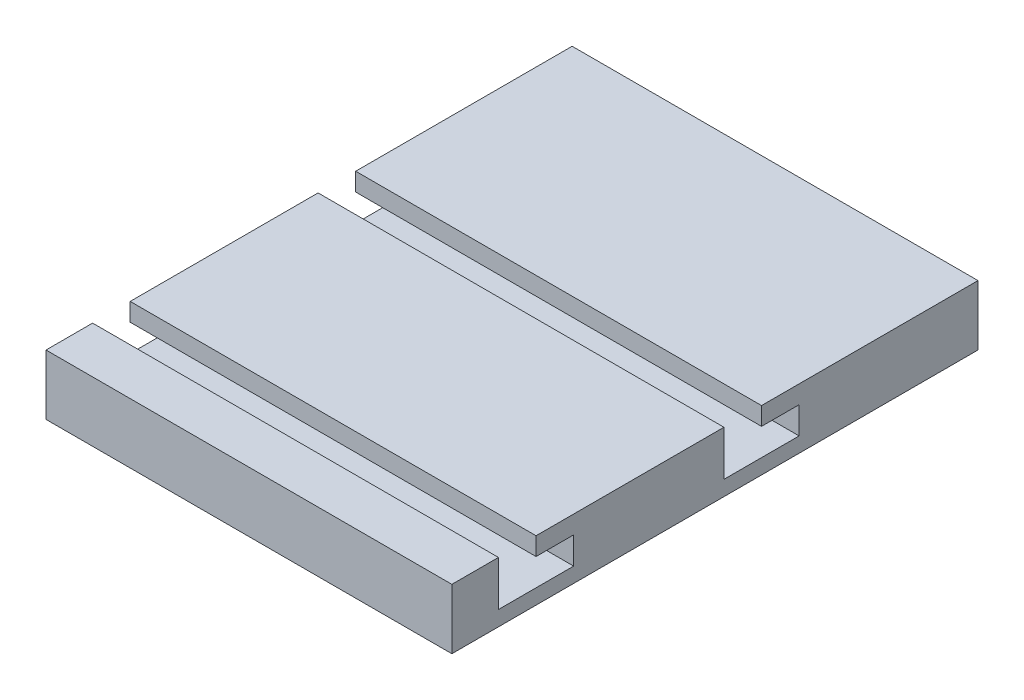
ISO-10303-21;
HEADER;
FILE_DESCRIPTION(('STEP AP214'),'2;1');
FILE_NAME('part.step','',(''),(''),'','','');
FILE_SCHEMA(('AUTOMOTIVE_DESIGN { 1 0 10303 214 1 1 1 1 }'));
ENDSEC;
DATA;
#1=APPLICATION_CONTEXT('core data for automotive mechanical design processes');
#2=APPLICATION_PROTOCOL_DEFINITION('international standard','automotive_design',2000,#1);
#3=PRODUCT_CONTEXT('',#1,'mechanical');
#4=PRODUCT('Part','Part','',(#3));
#5=PRODUCT_RELATED_PRODUCT_CATEGORY('part','',(#4));
#6=PRODUCT_DEFINITION_FORMATION('','',#4);
#7=PRODUCT_DEFINITION_CONTEXT('part definition',#1,'design');
#8=PRODUCT_DEFINITION('design','',#6,#7);
#9=PRODUCT_DEFINITION_SHAPE('','',#8);
#10=(LENGTH_UNIT() NAMED_UNIT(*) SI_UNIT(.MILLI.,.METRE.));
#11=(NAMED_UNIT(*) PLANE_ANGLE_UNIT() SI_UNIT($,.RADIAN.));
#12=(NAMED_UNIT(*) SI_UNIT($,.STERADIAN.) SOLID_ANGLE_UNIT());
#13=UNCERTAINTY_MEASURE_WITH_UNIT(LENGTH_MEASURE(1.E-05),#10,'distance_accuracy_value','');
#14=(GEOMETRIC_REPRESENTATION_CONTEXT(3) GLOBAL_UNCERTAINTY_ASSIGNED_CONTEXT((#13)) GLOBAL_UNIT_ASSIGNED_CONTEXT((#10,
#11,#12)) REPRESENTATION_CONTEXT('',''));
#15=CARTESIAN_POINT('',(0.,0.,0.));
#16=DIRECTION('',(0.,0.,1.));
#17=DIRECTION('',(1.,0.,0.));
#18=AXIS2_PLACEMENT_3D('',#15,#16,#17);
#19=CARTESIAN_POINT('',(0.,2.54,0.));
#20=DIRECTION('',(0.,-1.,0.));
#21=DIRECTION('',(0.,0.,-1.));
#22=AXIS2_PLACEMENT_3D('',#19,#20,#21);
#23=PLANE('',#22);
#24=DIRECTION('',(-1.,0.,0.));
#25=VECTOR('',#24,1.);
#26=CARTESIAN_POINT('',(0.,2.54,81.026));
#27=LINE('',#26,#25);
#28=CARTESIAN_POINT('',(0.,2.54,81.026));
#29=VERTEX_POINT('',#28);
#30=CARTESIAN_POINT('',(-68.58,2.54,81.026));
#31=VERTEX_POINT('',#30);
#32=EDGE_CURVE('E242',#29,#31,#27,.T.);
#33=ORIENTED_EDGE('',*,*,#32,.F.);
#34=DIRECTION('',(0.,0.,-1.));
#35=VECTOR('',#34,1.);
#36=CARTESIAN_POINT('',(0.,2.54,0.));
#37=LINE('',#36,#35);
#38=CARTESIAN_POINT('',(0.,2.54,68.326));
#39=VERTEX_POINT('',#38);
#40=EDGE_CURVE('E298',#29,#39,#37,.T.);
#41=ORIENTED_EDGE('',*,*,#40,.T.);
#42=DIRECTION('',(1.,0.,0.));
#43=VECTOR('',#42,1.);
#44=CARTESIAN_POINT('',(-68.58,2.54,68.326));
#45=LINE('',#44,#43);
#46=CARTESIAN_POINT('',(-68.58,2.54,68.326));
#47=VERTEX_POINT('',#46);
#48=EDGE_CURVE('E222',#47,#39,#45,.T.);
#49=ORIENTED_EDGE('',*,*,#48,.F.);
#50=DIRECTION('',(0.,0.,1.));
#51=VECTOR('',#50,1.);
#52=CARTESIAN_POINT('',(-68.58,2.54,0.));
#53=LINE('',#52,#51);
#54=EDGE_CURVE('E301',#47,#31,#53,.T.);
#55=ORIENTED_EDGE('',*,*,#54,.T.);
#56=EDGE_LOOP('',(#33,#41,#49,#55));
#57=FACE_BOUND('',#56,.T.);
#58=ADVANCED_FACE('F44',(#57),#23,.F.);
#59=DIRECTION('',(-1.,0.,0.));
#60=VECTOR('',#59,1.);
#61=CARTESIAN_POINT('',(0.,2.54,42.926));
#62=LINE('',#61,#60);
#63=CARTESIAN_POINT('',(0.,2.54,42.926));
#64=VERTEX_POINT('',#63);
#65=CARTESIAN_POINT('',(-68.58,2.54,42.926));
#66=VERTEX_POINT('',#65);
#67=EDGE_CURVE('E237',#64,#66,#62,.T.);
#68=ORIENTED_EDGE('',*,*,#67,.F.);
#69=CARTESIAN_POINT('',(0.,2.54,30.226));
#70=VERTEX_POINT('',#69);
#71=EDGE_CURVE('E302',#64,#70,#37,.T.);
#72=ORIENTED_EDGE('',*,*,#71,.T.);
#73=DIRECTION('',(1.,0.,0.));
#74=VECTOR('',#73,1.);
#75=CARTESIAN_POINT('',(-68.58,2.54,30.226));
#76=LINE('',#75,#74);
#77=CARTESIAN_POINT('',(-68.58,2.54,30.226));
#78=VERTEX_POINT('',#77);
#79=EDGE_CURVE('E180',#78,#70,#76,.T.);
#80=ORIENTED_EDGE('',*,*,#79,.F.);
#81=EDGE_CURVE('E305',#78,#66,#53,.T.);
#82=ORIENTED_EDGE('',*,*,#81,.T.);
#83=EDGE_LOOP('',(#68,#72,#80,#82));
#84=FACE_BOUND('',#83,.T.);
#85=ADVANCED_FACE('F373',(#84),#23,.F.);
#86=CARTESIAN_POINT('',(0.,2.54,0.));
#87=DIRECTION('',(-1.,0.,0.));
#88=DIRECTION('',(0.,0.,1.));
#89=AXIS2_PLACEMENT_3D('',#86,#87,#88);
#90=PLANE('',#89);
#91=DIRECTION('',(0.,0.,-1.));
#92=VECTOR('',#91,1.);
#93=CARTESIAN_POINT('',(0.,10.16,64.516));
#94=LINE('',#93,#92);
#95=CARTESIAN_POINT('',(0.,10.16,74.676));
#96=VERTEX_POINT('',#95);
#97=CARTESIAN_POINT('',(0.,10.16,42.926));
#98=VERTEX_POINT('',#97);
#99=EDGE_CURVE('E284',#96,#98,#94,.T.);
#100=ORIENTED_EDGE('',*,*,#99,.F.);
#101=DIRECTION('',(0.,1.,0.));
#102=VECTOR('',#101,1.);
#103=CARTESIAN_POINT('',(0.,7.11199999999999,74.676));
#104=LINE('',#103,#102);
#105=CARTESIAN_POINT('',(0.,7.11199999999999,74.676));
#106=VERTEX_POINT('',#105);
#107=EDGE_CURVE('E204',#106,#96,#104,.T.);
#108=ORIENTED_EDGE('',*,*,#107,.F.);
#109=DIRECTION('',(0.,0.,-1.));
#110=VECTOR('',#109,1.);
#111=CARTESIAN_POINT('',(0.,7.112,75.946));
#112=LINE('',#111,#110);
#113=CARTESIAN_POINT('',(0.,7.112,68.326));
#114=VERTEX_POINT('',#113);
#115=EDGE_CURVE('E236',#106,#114,#112,.T.);
#116=ORIENTED_EDGE('',*,*,#115,.T.);
#117=DIRECTION('',(0.,1.,0.));
#118=VECTOR('',#117,1.);
#119=CARTESIAN_POINT('',(0.,2.54,68.326));
#120=LINE('',#119,#118);
#121=EDGE_CURVE('E186',#39,#114,#120,.T.);
#122=ORIENTED_EDGE('',*,*,#121,.F.);
#123=ORIENTED_EDGE('',*,*,#40,.F.);
#124=DIRECTION('',(0.,-1.,0.));
#125=VECTOR('',#124,1.);
#126=CARTESIAN_POINT('',(0.,10.16,81.026));
#127=LINE('',#126,#125);
#128=CARTESIAN_POINT('',(0.,10.16,81.026));
#129=VERTEX_POINT('',#128);
#130=EDGE_CURVE('E228',#129,#29,#127,.T.);
#131=ORIENTED_EDGE('',*,*,#130,.F.);
#132=DIRECTION('',(0.,0.,-1.));
#133=VECTOR('',#132,1.);
#134=CARTESIAN_POINT('',(0.,10.16,81.026));
#135=LINE('',#134,#133);
#136=CARTESIAN_POINT('',(0.,10.16,88.9));
#137=VERTEX_POINT('',#136);
#138=EDGE_CURVE('E263',#137,#129,#135,.T.);
#139=ORIENTED_EDGE('',*,*,#138,.F.);
#140=DIRECTION('',(0.,-1.,0.));
#141=VECTOR('',#140,1.);
#142=CARTESIAN_POINT('',(0.,2.54,88.9));
#143=LINE('',#142,#141);
#144=CARTESIAN_POINT('',(0.,0.,88.9));
#145=VERTEX_POINT('',#144);
#146=EDGE_CURVE('E318',#137,#145,#143,.T.);
#147=ORIENTED_EDGE('',*,*,#146,.T.);
#148=DIRECTION('',(0.,0.,-1.));
#149=VECTOR('',#148,1.);
#150=CARTESIAN_POINT('',(0.,0.,0.));
#151=LINE('',#150,#149);
#152=CARTESIAN_POINT('',(0.,0.,0.));
#153=VERTEX_POINT('',#152);
#154=EDGE_CURVE('E292',#145,#153,#151,.T.);
#155=ORIENTED_EDGE('',*,*,#154,.T.);
#156=DIRECTION('',(0.,-1.,0.));
#157=VECTOR('',#156,1.);
#158=CARTESIAN_POINT('',(0.,2.54,0.));
#159=LINE('',#158,#157);
#160=CARTESIAN_POINT('',(0.,10.16,0.));
#161=VERTEX_POINT('',#160);
#162=EDGE_CURVE('E11',#161,#153,#159,.T.);
#163=ORIENTED_EDGE('',*,*,#162,.F.);
#164=DIRECTION('',(0.,0.,-1.));
#165=VECTOR('',#164,1.);
#166=CARTESIAN_POINT('',(0.,10.16,26.416));
#167=LINE('',#166,#165);
#168=CARTESIAN_POINT('',(0.,10.16,36.576));
#169=VERTEX_POINT('',#168);
#170=EDGE_CURVE('E288',#169,#161,#167,.T.);
#171=ORIENTED_EDGE('',*,*,#170,.F.);
#172=DIRECTION('',(0.,1.,0.));
#173=VECTOR('',#172,1.);
#174=CARTESIAN_POINT('',(0.,7.112,36.576));
#175=LINE('',#174,#173);
#176=CARTESIAN_POINT('',(0.,7.112,36.576));
#177=VERTEX_POINT('',#176);
#178=EDGE_CURVE('E166',#177,#169,#175,.T.);
#179=ORIENTED_EDGE('',*,*,#178,.F.);
#180=DIRECTION('',(0.,0.,-1.));
#181=VECTOR('',#180,1.);
#182=CARTESIAN_POINT('',(0.,7.112,37.846));
#183=LINE('',#182,#181);
#184=CARTESIAN_POINT('',(0.,7.112,30.226));
#185=VERTEX_POINT('',#184);
#186=EDGE_CURVE('E159',#177,#185,#183,.T.);
#187=ORIENTED_EDGE('',*,*,#186,.T.);
#188=DIRECTION('',(0.,1.,0.));
#189=VECTOR('',#188,1.);
#190=CARTESIAN_POINT('',(0.,2.54,30.226));
#191=LINE('',#190,#189);
#192=EDGE_CURVE('E164',#70,#185,#191,.T.);
#193=ORIENTED_EDGE('',*,*,#192,.F.);
#194=ORIENTED_EDGE('',*,*,#71,.F.);
#195=DIRECTION('',(0.,-1.,0.));
#196=VECTOR('',#195,1.);
#197=CARTESIAN_POINT('',(0.,10.16,42.926));
#198=LINE('',#197,#196);
#199=EDGE_CURVE('E238',#98,#64,#198,.T.);
#200=ORIENTED_EDGE('',*,*,#199,.F.);
#201=EDGE_LOOP('',(#100,#108,#116,#122,#123,#131,#139,#147,#155,#163,#171,#179,#187,#193,#194,#200));
#202=FACE_BOUND('',#201,.T.);
#203=ADVANCED_FACE('F46',(#202),#90,.F.);
#204=CARTESIAN_POINT('',(0.,2.54,0.));
#205=DIRECTION('',(0.,0.,1.));
#206=DIRECTION('',(1.,0.,0.));
#207=AXIS2_PLACEMENT_3D('',#204,#205,#206);
#208=PLANE('',#207);
#209=DIRECTION('',(-1.,0.,0.));
#210=VECTOR('',#209,1.);
#211=CARTESIAN_POINT('',(0.,0.,0.));
#212=LINE('',#211,#210);
#213=CARTESIAN_POINT('',(-68.58,0.,0.));
#214=VERTEX_POINT('',#213);
#215=EDGE_CURVE('E309',#153,#214,#212,.T.);
#216=ORIENTED_EDGE('',*,*,#215,.T.);
#217=DIRECTION('',(0.,-1.,0.));
#218=VECTOR('',#217,1.);
#219=CARTESIAN_POINT('',(-68.58,2.54,0.));
#220=LINE('',#219,#218);
#221=CARTESIAN_POINT('',(-68.58,10.16,0.));
#222=VERTEX_POINT('',#221);
#223=EDGE_CURVE('E53',#222,#214,#220,.T.);
#224=ORIENTED_EDGE('',*,*,#223,.F.);
#225=DIRECTION('',(-1.,0.,0.));
#226=VECTOR('',#225,1.);
#227=CARTESIAN_POINT('',(0.,10.16,0.));
#228=LINE('',#227,#226);
#229=EDGE_CURVE('E232',#161,#222,#228,.T.);
#230=ORIENTED_EDGE('',*,*,#229,.F.);
#231=ORIENTED_EDGE('',*,*,#162,.T.);
#232=EDGE_LOOP('',(#216,#224,#230,#231));
#233=FACE_BOUND('',#232,.T.);
#234=ADVANCED_FACE('F379',(#233),#208,.F.);
#235=CARTESIAN_POINT('',(-68.58,2.54,0.));
#236=DIRECTION('',(1.,0.,0.));
#237=DIRECTION('',(0.,0.,-1.));
#238=AXIS2_PLACEMENT_3D('',#235,#236,#237);
#239=PLANE('',#238);
#240=DIRECTION('',(0.,0.,-1.));
#241=VECTOR('',#240,1.);
#242=CARTESIAN_POINT('',(-68.58,7.112,75.946));
#243=LINE('',#242,#241);
#244=CARTESIAN_POINT('',(-68.58,7.112,74.676));
#245=VERTEX_POINT('',#244);
#246=CARTESIAN_POINT('',(-68.58,7.112,68.326));
#247=VERTEX_POINT('',#246);
#248=EDGE_CURVE('E170',#245,#247,#243,.T.);
#249=ORIENTED_EDGE('',*,*,#248,.F.);
#250=DIRECTION('',(0.,1.,0.));
#251=VECTOR('',#250,1.);
#252=CARTESIAN_POINT('',(-68.58,7.11199999999999,74.676));
#253=LINE('',#252,#251);
#254=CARTESIAN_POINT('',(-68.58,10.16,74.676));
#255=VERTEX_POINT('',#254);
#256=EDGE_CURVE('E68',#245,#255,#253,.T.);
#257=ORIENTED_EDGE('',*,*,#256,.T.);
#258=DIRECTION('',(0.,0.,1.));
#259=VECTOR('',#258,1.);
#260=CARTESIAN_POINT('',(-68.58,10.16,64.516));
#261=LINE('',#260,#259);
#262=CARTESIAN_POINT('',(-68.58,10.16,42.926));
#263=VERTEX_POINT('',#262);
#264=EDGE_CURVE('E287',#263,#255,#261,.T.);
#265=ORIENTED_EDGE('',*,*,#264,.F.);
#266=DIRECTION('',(0.,-1.,0.));
#267=VECTOR('',#266,1.);
#268=CARTESIAN_POINT('',(-68.58,10.16,42.926));
#269=LINE('',#268,#267);
#270=EDGE_CURVE('E241',#263,#66,#269,.T.);
#271=ORIENTED_EDGE('',*,*,#270,.T.);
#272=ORIENTED_EDGE('',*,*,#81,.F.);
#273=DIRECTION('',(0.,1.,0.));
#274=VECTOR('',#273,1.);
#275=CARTESIAN_POINT('',(-68.58,2.54,30.226));
#276=LINE('',#275,#274);
#277=CARTESIAN_POINT('',(-68.58,7.112,30.226));
#278=VERTEX_POINT('',#277);
#279=EDGE_CURVE('E187',#78,#278,#276,.T.);
#280=ORIENTED_EDGE('',*,*,#279,.T.);
#281=DIRECTION('',(0.,0.,-1.));
#282=VECTOR('',#281,1.);
#283=CARTESIAN_POINT('',(-68.58,7.112,37.846));
#284=LINE('',#283,#282);
#285=CARTESIAN_POINT('',(-68.58,7.112,36.576));
#286=VERTEX_POINT('',#285);
#287=EDGE_CURVE('E169',#286,#278,#284,.T.);
#288=ORIENTED_EDGE('',*,*,#287,.F.);
#289=DIRECTION('',(0.,1.,0.));
#290=VECTOR('',#289,1.);
#291=CARTESIAN_POINT('',(-68.58,7.112,36.576));
#292=LINE('',#291,#290);
#293=CARTESIAN_POINT('',(-68.58,10.16,36.576));
#294=VERTEX_POINT('',#293);
#295=EDGE_CURVE('E60',#286,#294,#292,.T.);
#296=ORIENTED_EDGE('',*,*,#295,.T.);
#297=DIRECTION('',(0.,0.,1.));
#298=VECTOR('',#297,1.);
#299=CARTESIAN_POINT('',(-68.58,10.16,26.416));
#300=LINE('',#299,#298);
#301=EDGE_CURVE('E283',#222,#294,#300,.T.);
#302=ORIENTED_EDGE('',*,*,#301,.F.);
#303=ORIENTED_EDGE('',*,*,#223,.T.);
#304=DIRECTION('',(0.,0.,1.));
#305=VECTOR('',#304,1.);
#306=CARTESIAN_POINT('',(-68.58,0.,0.));
#307=LINE('',#306,#305);
#308=CARTESIAN_POINT('',(-68.58,0.,88.9));
#309=VERTEX_POINT('',#308);
#310=EDGE_CURVE('E312',#214,#309,#307,.T.);
#311=ORIENTED_EDGE('',*,*,#310,.T.);
#312=DIRECTION('',(0.,-1.,0.));
#313=VECTOR('',#312,1.);
#314=CARTESIAN_POINT('',(-68.58,2.54,88.9));
#315=LINE('',#314,#313);
#316=CARTESIAN_POINT('',(-68.58,10.16,88.9));
#317=VERTEX_POINT('',#316);
#318=EDGE_CURVE('E322',#317,#309,#315,.T.);
#319=ORIENTED_EDGE('',*,*,#318,.F.);
#320=DIRECTION('',(0.,0.,1.));
#321=VECTOR('',#320,1.);
#322=CARTESIAN_POINT('',(-68.58,10.16,81.026));
#323=LINE('',#322,#321);
#324=CARTESIAN_POINT('',(-68.58,10.16,81.026));
#325=VERTEX_POINT('',#324);
#326=EDGE_CURVE('E267',#325,#317,#323,.T.);
#327=ORIENTED_EDGE('',*,*,#326,.F.);
#328=DIRECTION('',(0.,-1.,0.));
#329=VECTOR('',#328,1.);
#330=CARTESIAN_POINT('',(-68.58,10.16,81.026));
#331=LINE('',#330,#329);
#332=EDGE_CURVE('E255',#325,#31,#331,.T.);
#333=ORIENTED_EDGE('',*,*,#332,.T.);
#334=ORIENTED_EDGE('',*,*,#54,.F.);
#335=DIRECTION('',(0.,1.,0.));
#336=VECTOR('',#335,1.);
#337=CARTESIAN_POINT('',(-68.58,2.54,68.326));
#338=LINE('',#337,#336);
#339=EDGE_CURVE('E192',#47,#247,#338,.T.);
#340=ORIENTED_EDGE('',*,*,#339,.T.);
#341=EDGE_LOOP('',(#249,#257,#265,#271,#272,#280,#288,#296,#302,#303,#311,#319,#327,#333,#334,#340));
#342=FACE_BOUND('',#341,.T.);
#343=ADVANCED_FACE('F331',(#342),#239,.F.);
#344=CARTESIAN_POINT('',(0.,2.54,88.9));
#345=DIRECTION('',(0.,0.,-1.));
#346=DIRECTION('',(-1.,0.,0.));
#347=AXIS2_PLACEMENT_3D('',#344,#345,#346);
#348=PLANE('',#347);
#349=DIRECTION('',(1.,0.,0.));
#350=VECTOR('',#349,1.);
#351=CARTESIAN_POINT('',(0.,0.,88.9));
#352=LINE('',#351,#350);
#353=EDGE_CURVE('E315',#309,#145,#352,.T.);
#354=ORIENTED_EDGE('',*,*,#353,.T.);
#355=ORIENTED_EDGE('',*,*,#146,.F.);
#356=DIRECTION('',(1.,0.,0.));
#357=VECTOR('',#356,1.);
#358=CARTESIAN_POINT('',(0.,10.16,88.9));
#359=LINE('',#358,#357);
#360=EDGE_CURVE('E259',#317,#137,#359,.T.);
#361=ORIENTED_EDGE('',*,*,#360,.F.);
#362=ORIENTED_EDGE('',*,*,#318,.T.);
#363=EDGE_LOOP('',(#354,#355,#361,#362));
#364=FACE_BOUND('',#363,.T.);
#365=ADVANCED_FACE('F339',(#364),#348,.F.);
#366=CARTESIAN_POINT('',(0.,0.,0.));
#367=DIRECTION('',(0.,-1.,0.));
#368=DIRECTION('',(0.,0.,-1.));
#369=AXIS2_PLACEMENT_3D('',#366,#367,#368);
#370=PLANE('',#369);
#371=ORIENTED_EDGE('',*,*,#154,.F.);
#372=ORIENTED_EDGE('',*,*,#353,.F.);
#373=ORIENTED_EDGE('',*,*,#310,.F.);
#374=ORIENTED_EDGE('',*,*,#215,.F.);
#375=EDGE_LOOP('',(#371,#372,#373,#374));
#376=FACE_BOUND('',#375,.T.);
#377=ADVANCED_FACE('F337',(#376),#370,.T.);
#378=CARTESIAN_POINT('',(0.,10.16,0.));
#379=DIRECTION('',(0.,-1.,0.));
#380=DIRECTION('',(0.,0.,-1.));
#381=AXIS2_PLACEMENT_3D('',#378,#379,#380);
#382=PLANE('',#381);
#383=ORIENTED_EDGE('',*,*,#301,.T.);
#384=DIRECTION('',(1.,0.,0.));
#385=VECTOR('',#384,1.);
#386=CARTESIAN_POINT('',(-68.58,10.16,36.576));
#387=LINE('',#386,#385);
#388=EDGE_CURVE('E200',#294,#169,#387,.T.);
#389=ORIENTED_EDGE('',*,*,#388,.T.);
#390=ORIENTED_EDGE('',*,*,#170,.T.);
#391=ORIENTED_EDGE('',*,*,#229,.T.);
#392=EDGE_LOOP('',(#383,#389,#390,#391));
#393=FACE_BOUND('',#392,.T.);
#394=ADVANCED_FACE('F378',(#393),#382,.F.);
#395=CARTESIAN_POINT('',(0.,10.16,0.));
#396=DIRECTION('',(0.,-1.,0.));
#397=DIRECTION('',(0.,0.,-1.));
#398=AXIS2_PLACEMENT_3D('',#395,#396,#397);
#399=PLANE('',#398);
#400=ORIENTED_EDGE('',*,*,#264,.T.);
#401=DIRECTION('',(1.,0.,0.));
#402=VECTOR('',#401,1.);
#403=CARTESIAN_POINT('',(-68.58,10.16,74.676));
#404=LINE('',#403,#402);
#405=EDGE_CURVE('E212',#255,#96,#404,.T.);
#406=ORIENTED_EDGE('',*,*,#405,.T.);
#407=ORIENTED_EDGE('',*,*,#99,.T.);
#408=DIRECTION('',(-1.,0.,0.));
#409=VECTOR('',#408,1.);
#410=CARTESIAN_POINT('',(0.,10.16,42.926));
#411=LINE('',#410,#409);
#412=EDGE_CURVE('E246',#98,#263,#411,.T.);
#413=ORIENTED_EDGE('',*,*,#412,.T.);
#414=EDGE_LOOP('',(#400,#406,#407,#413));
#415=FACE_BOUND('',#414,.T.);
#416=ADVANCED_FACE('F366',(#415),#399,.F.);
#417=CARTESIAN_POINT('',(-68.58,7.112,37.846));
#418=DIRECTION('',(0.,1.,0.));
#419=DIRECTION('',(0.,0.,1.));
#420=AXIS2_PLACEMENT_3D('',#417,#418,#419);
#421=PLANE('',#420);
#422=ORIENTED_EDGE('',*,*,#186,.F.);
#423=DIRECTION('',(1.,0.,0.));
#424=VECTOR('',#423,1.);
#425=CARTESIAN_POINT('',(-68.58,7.112,36.576));
#426=LINE('',#425,#424);
#427=EDGE_CURVE('E197',#286,#177,#426,.T.);
#428=ORIENTED_EDGE('',*,*,#427,.F.);
#429=ORIENTED_EDGE('',*,*,#287,.T.);
#430=DIRECTION('',(1.,0.,0.));
#431=VECTOR('',#430,1.);
#432=CARTESIAN_POINT('',(-68.58,7.112,30.226));
#433=LINE('',#432,#431);
#434=EDGE_CURVE('E173',#278,#185,#433,.T.);
#435=ORIENTED_EDGE('',*,*,#434,.T.);
#436=EDGE_LOOP('',(#422,#428,#429,#435));
#437=FACE_BOUND('',#436,.T.);
#438=ADVANCED_FACE('F174',(#437),#421,.F.);
#439=CARTESIAN_POINT('',(-68.58,7.112,75.946));
#440=DIRECTION('',(0.,1.,0.));
#441=DIRECTION('',(0.,0.,1.));
#442=AXIS2_PLACEMENT_3D('',#439,#440,#441);
#443=PLANE('',#442);
#444=ORIENTED_EDGE('',*,*,#115,.F.);
#445=DIRECTION('',(1.,0.,0.));
#446=VECTOR('',#445,1.);
#447=CARTESIAN_POINT('',(-68.58,7.11199999999999,74.676));
#448=LINE('',#447,#446);
#449=EDGE_CURVE('E209',#245,#106,#448,.T.);
#450=ORIENTED_EDGE('',*,*,#449,.F.);
#451=ORIENTED_EDGE('',*,*,#248,.T.);
#452=DIRECTION('',(1.,0.,0.));
#453=VECTOR('',#452,1.);
#454=CARTESIAN_POINT('',(-68.58,7.112,68.326));
#455=LINE('',#454,#453);
#456=EDGE_CURVE('E224',#247,#114,#455,.T.);
#457=ORIENTED_EDGE('',*,*,#456,.T.);
#458=EDGE_LOOP('',(#444,#450,#451,#457));
#459=FACE_BOUND('',#458,.T.);
#460=ADVANCED_FACE('F361',(#459),#443,.F.);
#461=CARTESIAN_POINT('',(0.,10.16,42.926));
#462=DIRECTION('',(0.,0.,1.));
#463=DIRECTION('',(1.,0.,0.));
#464=AXIS2_PLACEMENT_3D('',#461,#462,#463);
#465=PLANE('',#464);
#466=ORIENTED_EDGE('',*,*,#67,.T.);
#467=ORIENTED_EDGE('',*,*,#270,.F.);
#468=ORIENTED_EDGE('',*,*,#412,.F.);
#469=ORIENTED_EDGE('',*,*,#199,.T.);
#470=EDGE_LOOP('',(#466,#467,#468,#469));
#471=FACE_BOUND('',#470,.T.);
#472=ADVANCED_FACE('F369',(#471),#465,.F.);
#473=CARTESIAN_POINT('',(0.,10.16,81.026));
#474=DIRECTION('',(0.,0.,1.));
#475=DIRECTION('',(1.,0.,0.));
#476=AXIS2_PLACEMENT_3D('',#473,#474,#475);
#477=PLANE('',#476);
#478=ORIENTED_EDGE('',*,*,#32,.T.);
#479=ORIENTED_EDGE('',*,*,#332,.F.);
#480=DIRECTION('',(-1.,0.,0.));
#481=VECTOR('',#480,1.);
#482=CARTESIAN_POINT('',(0.,10.16,81.026));
#483=LINE('',#482,#481);
#484=EDGE_CURVE('E271',#129,#325,#483,.T.);
#485=ORIENTED_EDGE('',*,*,#484,.F.);
#486=ORIENTED_EDGE('',*,*,#130,.T.);
#487=EDGE_LOOP('',(#478,#479,#485,#486));
#488=FACE_BOUND('',#487,.T.);
#489=ADVANCED_FACE('F351',(#488),#477,.F.);
#490=CARTESIAN_POINT('',(0.,10.16,0.));
#491=DIRECTION('',(0.,-1.,0.));
#492=DIRECTION('',(0.,0.,-1.));
#493=AXIS2_PLACEMENT_3D('',#490,#491,#492);
#494=PLANE('',#493);
#495=ORIENTED_EDGE('',*,*,#138,.T.);
#496=ORIENTED_EDGE('',*,*,#484,.T.);
#497=ORIENTED_EDGE('',*,*,#326,.T.);
#498=ORIENTED_EDGE('',*,*,#360,.T.);
#499=EDGE_LOOP('',(#495,#496,#497,#498));
#500=FACE_BOUND('',#499,.T.);
#501=ADVANCED_FACE('F346',(#500),#494,.F.);
#502=CARTESIAN_POINT('',(-68.58,2.54,68.326));
#503=DIRECTION('',(0.,0.,-1.));
#504=DIRECTION('',(-1.,0.,0.));
#505=AXIS2_PLACEMENT_3D('',#502,#503,#504);
#506=PLANE('',#505);
#507=ORIENTED_EDGE('',*,*,#121,.T.);
#508=ORIENTED_EDGE('',*,*,#456,.F.);
#509=ORIENTED_EDGE('',*,*,#339,.F.);
#510=ORIENTED_EDGE('',*,*,#48,.T.);
#511=EDGE_LOOP('',(#507,#508,#509,#510));
#512=FACE_BOUND('',#511,.T.);
#513=ADVANCED_FACE('F358',(#512),#506,.F.);
#514=CARTESIAN_POINT('',(-68.58,7.11199999999999,74.676));
#515=DIRECTION('',(0.,0.,-1.));
#516=DIRECTION('',(-1.,0.,0.));
#517=AXIS2_PLACEMENT_3D('',#514,#515,#516);
#518=PLANE('',#517);
#519=ORIENTED_EDGE('',*,*,#107,.T.);
#520=ORIENTED_EDGE('',*,*,#405,.F.);
#521=ORIENTED_EDGE('',*,*,#256,.F.);
#522=ORIENTED_EDGE('',*,*,#449,.T.);
#523=EDGE_LOOP('',(#519,#520,#521,#522));
#524=FACE_BOUND('',#523,.T.);
#525=ADVANCED_FACE('F362',(#524),#518,.F.);
#526=CARTESIAN_POINT('',(-68.58,2.54,30.226));
#527=DIRECTION('',(0.,0.,-1.));
#528=DIRECTION('',(-1.,0.,0.));
#529=AXIS2_PLACEMENT_3D('',#526,#527,#528);
#530=PLANE('',#529);
#531=ORIENTED_EDGE('',*,*,#192,.T.);
#532=ORIENTED_EDGE('',*,*,#434,.F.);
#533=ORIENTED_EDGE('',*,*,#279,.F.);
#534=ORIENTED_EDGE('',*,*,#79,.T.);
#535=EDGE_LOOP('',(#531,#532,#533,#534));
#536=FACE_BOUND('',#535,.T.);
#537=ADVANCED_FACE('F183',(#536),#530,.F.);
#538=CARTESIAN_POINT('',(-68.58,7.112,36.576));
#539=DIRECTION('',(0.,0.,-1.));
#540=DIRECTION('',(-1.,0.,0.));
#541=AXIS2_PLACEMENT_3D('',#538,#539,#540);
#542=PLANE('',#541);
#543=ORIENTED_EDGE('',*,*,#178,.T.);
#544=ORIENTED_EDGE('',*,*,#388,.F.);
#545=ORIENTED_EDGE('',*,*,#295,.F.);
#546=ORIENTED_EDGE('',*,*,#427,.T.);
#547=EDGE_LOOP('',(#543,#544,#545,#546));
#548=FACE_BOUND('',#547,.T.);
#549=ADVANCED_FACE('F485',(#548),#542,.F.);
#550=CLOSED_SHELL('',(#58,#85,#203,#234,#343,#365,#377,#394,#416,#438,#460,#472,#489,#501,#513,
#525,#537,#549));
#551=MANIFOLD_SOLID_BREP('B2',#550);
#552=ADVANCED_BREP_SHAPE_REPRESENTATION('',(#18,#551),#14);
#553=SHAPE_DEFINITION_REPRESENTATION(#9,#552);
ENDSEC;
END-ISO-10303-21;
